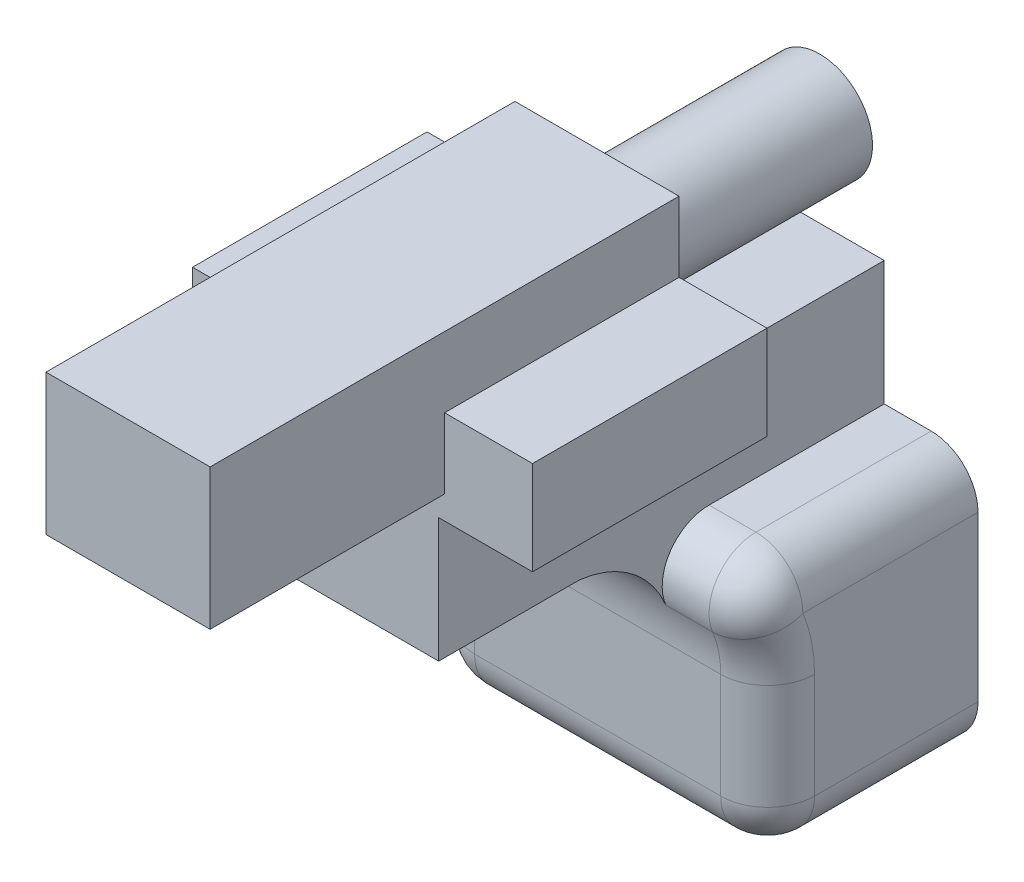
ISO-10303-21;
HEADER;
FILE_DESCRIPTION(('STEP AP214'),'2;1');
FILE_NAME('part.step','',(''),(''),'','','');
FILE_SCHEMA(('AUTOMOTIVE_DESIGN { 1 0 10303 214 1 1 1 1 }'));
ENDSEC;
DATA;
#1=APPLICATION_CONTEXT('core data for automotive mechanical design processes');
#2=APPLICATION_PROTOCOL_DEFINITION('international standard','automotive_design',2000,#1);
#3=PRODUCT_CONTEXT('',#1,'mechanical');
#4=PRODUCT('Part','Part','',(#3));
#5=PRODUCT_RELATED_PRODUCT_CATEGORY('part','',(#4));
#6=PRODUCT_DEFINITION_FORMATION('','',#4);
#7=PRODUCT_DEFINITION_CONTEXT('part definition',#1,'design');
#8=PRODUCT_DEFINITION('design','',#6,#7);
#9=PRODUCT_DEFINITION_SHAPE('','',#8);
#10=(LENGTH_UNIT() NAMED_UNIT(*) SI_UNIT(.MILLI.,.METRE.));
#11=(NAMED_UNIT(*) PLANE_ANGLE_UNIT() SI_UNIT($,.RADIAN.));
#12=(NAMED_UNIT(*) SI_UNIT($,.STERADIAN.) SOLID_ANGLE_UNIT());
#13=UNCERTAINTY_MEASURE_WITH_UNIT(LENGTH_MEASURE(1.E-05),#10,'distance_accuracy_value','');
#14=(GEOMETRIC_REPRESENTATION_CONTEXT(3) GLOBAL_UNCERTAINTY_ASSIGNED_CONTEXT((#13)) GLOBAL_UNIT_ASSIGNED_CONTEXT((#10,
#11,#12)) REPRESENTATION_CONTEXT('',''));
#15=CARTESIAN_POINT('',(0.,0.,0.));
#16=DIRECTION('',(0.,0.,1.));
#17=DIRECTION('',(1.,0.,0.));
#18=AXIS2_PLACEMENT_3D('',#15,#16,#17);
#19=CARTESIAN_POINT('',(-3.75,0.,10.));
#20=DIRECTION('',(0.,-1.,0.));
#21=DIRECTION('',(1.,0.,0.));
#22=AXIS2_PLACEMENT_3D('',#19,#20,#21);
#23=PLANE('',#22);
#24=DIRECTION('',(1.,0.,0.));
#25=VECTOR('',#24,1.);
#26=CARTESIAN_POINT('',(-3.75,0.,-9.));
#27=LINE('',#26,#25);
#28=CARTESIAN_POINT('',(-5.75,0.,-9.));
#29=VERTEX_POINT('',#28);
#30=CARTESIAN_POINT('',(-3.75,0.,-9.));
#31=VERTEX_POINT('',#30);
#32=EDGE_CURVE('E277',#29,#31,#27,.T.);
#33=ORIENTED_EDGE('',*,*,#32,.F.);
#34=DIRECTION('',(0.,0.,-1.));
#35=VECTOR('',#34,1.);
#36=CARTESIAN_POINT('',(-5.75,0.,10.));
#37=LINE('',#36,#35);
#38=CARTESIAN_POINT('',(-5.75,0.,-1.52998924346261));
#39=VERTEX_POINT('',#38);
#40=EDGE_CURVE('E59',#29,#39,#37,.F.);
#41=ORIENTED_EDGE('',*,*,#40,.T.);
#42=DIRECTION('',(-1.,0.,0.));
#43=VECTOR('',#42,1.);
#44=CARTESIAN_POINT('',(-3.75,0.,-1.52998924346261));
#45=LINE('',#44,#43);
#46=CARTESIAN_POINT('',(-3.75,0.,-1.52998924346261));
#47=VERTEX_POINT('',#46);
#48=EDGE_CURVE('E442',#39,#47,#45,.F.);
#49=ORIENTED_EDGE('',*,*,#48,.T.);
#50=DIRECTION('',(0.,0.,-1.));
#51=VECTOR('',#50,1.);
#52=CARTESIAN_POINT('',(-3.75,0.,10.));
#53=LINE('',#52,#51);
#54=EDGE_CURVE('E252',#47,#31,#53,.T.);
#55=ORIENTED_EDGE('',*,*,#54,.T.);
#56=EDGE_LOOP('',(#33,#41,#49,#55));
#57=FACE_BOUND('',#56,.T.);
#58=ADVANCED_FACE('F34',(#57),#23,.F.);
#59=CARTESIAN_POINT('',(-7.75,0.,10.));
#60=DIRECTION('',(1.,0.,0.));
#61=DIRECTION('',(0.,0.,-1.));
#62=AXIS2_PLACEMENT_3D('',#59,#60,#61);
#63=PLANE('',#62);
#64=CARTESIAN_POINT('',(-7.75,-4.5,4.5));
#65=DIRECTION('',(1.,0.,0.));
#66=DIRECTION('',(0.,0.,-1.));
#67=AXIS2_PLACEMENT_3D('',#64,#65,#66);
#68=CIRCLE('',#67,6.52769256906871);
#69=CARTESIAN_POINT('',(-7.75,-4.5,-2.02769256906871));
#70=VERTEX_POINT('',#69);
#71=CARTESIAN_POINT('',(-7.75,-2.,-1.52998924346261));
#72=VERTEX_POINT('',#71);
#73=EDGE_CURVE('E414',#70,#72,#68,.T.);
#74=ORIENTED_EDGE('',*,*,#73,.T.);
#75=DIRECTION('',(0.,0.,-1.));
#76=VECTOR('',#75,1.);
#77=CARTESIAN_POINT('',(-7.75,-2.,10.));
#78=LINE('',#77,#76);
#79=CARTESIAN_POINT('',(-7.75,-2.,-9.));
#80=VERTEX_POINT('',#79);
#81=EDGE_CURVE('E416',#72,#80,#78,.T.);
#82=ORIENTED_EDGE('',*,*,#81,.T.);
#83=DIRECTION('',(0.,1.,0.));
#84=VECTOR('',#83,1.);
#85=CARTESIAN_POINT('',(-7.75,0.,-9.));
#86=LINE('',#85,#84);
#87=CARTESIAN_POINT('',(-7.75,-9.,-9.));
#88=VERTEX_POINT('',#87);
#89=EDGE_CURVE('E274',#88,#80,#86,.T.);
#90=ORIENTED_EDGE('',*,*,#89,.F.);
#91=DIRECTION('',(0.,0.,-1.));
#92=VECTOR('',#91,1.);
#93=CARTESIAN_POINT('',(-7.75,-9.,10.));
#94=LINE('',#93,#92);
#95=CARTESIAN_POINT('',(-7.75,-9.,-2.02769256906871));
#96=VERTEX_POINT('',#95);
#97=EDGE_CURVE('E410',#88,#96,#94,.F.);
#98=ORIENTED_EDGE('',*,*,#97,.T.);
#99=DIRECTION('',(0.,-1.,0.));
#100=VECTOR('',#99,1.);
#101=CARTESIAN_POINT('',(-7.75,-4.5,-2.02769256906871));
#102=LINE('',#101,#100);
#103=EDGE_CURVE('E412',#96,#70,#102,.F.);
#104=ORIENTED_EDGE('',*,*,#103,.T.);
#105=EDGE_LOOP('',(#74,#82,#90,#98,#104));
#106=FACE_BOUND('',#105,.T.);
#107=ADVANCED_FACE('F497',(#106),#63,.F.);
#108=CARTESIAN_POINT('',(-7.75,-11.,10.));
#109=DIRECTION('',(0.,1.,0.));
#110=DIRECTION('',(0.,0.,1.));
#111=AXIS2_PLACEMENT_3D('',#108,#109,#110);
#112=PLANE('',#111);
#113=DIRECTION('',(1.,0.,0.));
#114=VECTOR('',#113,1.);
#115=CARTESIAN_POINT('',(-7.75,-11.,-2.02769256906871));
#116=LINE('',#115,#114);
#117=CARTESIAN_POINT('',(4.75,-11.,-2.02769256906871));
#118=VERTEX_POINT('',#117);
#119=CARTESIAN_POINT('',(-5.75,-11.,-2.02769256906871));
#120=VERTEX_POINT('',#119);
#121=EDGE_CURVE('E426',#118,#120,#116,.F.);
#122=ORIENTED_EDGE('',*,*,#121,.T.);
#123=DIRECTION('',(0.,0.,-1.));
#124=VECTOR('',#123,1.);
#125=CARTESIAN_POINT('',(-5.75,-11.,10.));
#126=LINE('',#125,#124);
#127=CARTESIAN_POINT('',(-5.75,-11.,-9.));
#128=VERTEX_POINT('',#127);
#129=EDGE_CURVE('E428',#120,#128,#126,.T.);
#130=ORIENTED_EDGE('',*,*,#129,.T.);
#131=DIRECTION('',(-1.,0.,0.));
#132=VECTOR('',#131,1.);
#133=CARTESIAN_POINT('',(-7.75,-11.,-9.));
#134=LINE('',#133,#132);
#135=CARTESIAN_POINT('',(4.75,-11.,-9.));
#136=VERTEX_POINT('',#135);
#137=EDGE_CURVE('E271',#136,#128,#134,.T.);
#138=ORIENTED_EDGE('',*,*,#137,.F.);
#139=DIRECTION('',(0.,0.,-1.));
#140=VECTOR('',#139,1.);
#141=CARTESIAN_POINT('',(4.75,-11.,10.));
#142=LINE('',#141,#140);
#143=EDGE_CURVE('E424',#136,#118,#142,.F.);
#144=ORIENTED_EDGE('',*,*,#143,.T.);
#145=EDGE_LOOP('',(#122,#130,#138,#144));
#146=FACE_BOUND('',#145,.T.);
#147=ADVANCED_FACE('F594',(#146),#112,.F.);
#148=CARTESIAN_POINT('',(6.75,-11.,10.));
#149=DIRECTION('',(-1.,0.,0.));
#150=DIRECTION('',(0.,-1.,0.));
#151=AXIS2_PLACEMENT_3D('',#148,#149,#150);
#152=PLANE('',#151);
#153=DIRECTION('',(0.,-1.,0.));
#154=VECTOR('',#153,1.);
#155=CARTESIAN_POINT('',(6.75,-11.,-9.));
#156=LINE('',#155,#154);
#157=CARTESIAN_POINT('',(6.75,-2.,-9.));
#158=VERTEX_POINT('',#157);
#159=CARTESIAN_POINT('',(6.75,-9.,-9.));
#160=VERTEX_POINT('',#159);
#161=EDGE_CURVE('E268',#158,#160,#156,.T.);
#162=ORIENTED_EDGE('',*,*,#161,.F.);
#163=DIRECTION('',(0.,0.,-1.));
#164=VECTOR('',#163,1.);
#165=CARTESIAN_POINT('',(6.75,-2.,10.));
#166=LINE('',#165,#164);
#167=CARTESIAN_POINT('',(6.75,-2.,-1.52998924346261));
#168=VERTEX_POINT('',#167);
#169=EDGE_CURVE('E243',#158,#168,#166,.F.);
#170=ORIENTED_EDGE('',*,*,#169,.T.);
#171=CARTESIAN_POINT('',(6.75,-4.5,4.5));
#172=DIRECTION('',(-1.,0.,0.));
#173=DIRECTION('',(0.,-1.,0.));
#174=AXIS2_PLACEMENT_3D('',#171,#172,#173);
#175=CIRCLE('',#174,6.52769256906871);
#176=CARTESIAN_POINT('',(6.75,-4.5,-2.02769256906871));
#177=VERTEX_POINT('',#176);
#178=EDGE_CURVE('E398',#168,#177,#175,.T.);
#179=ORIENTED_EDGE('',*,*,#178,.T.);
#180=DIRECTION('',(0.,-1.,0.));
#181=VECTOR('',#180,1.);
#182=CARTESIAN_POINT('',(6.75,-11.,-2.02769256906871));
#183=LINE('',#182,#181);
#184=CARTESIAN_POINT('',(6.75,-9.,-2.02769256906871));
#185=VERTEX_POINT('',#184);
#186=EDGE_CURVE('E396',#177,#185,#183,.T.);
#187=ORIENTED_EDGE('',*,*,#186,.T.);
#188=DIRECTION('',(0.,0.,-1.));
#189=VECTOR('',#188,1.);
#190=CARTESIAN_POINT('',(6.75,-9.,10.));
#191=LINE('',#190,#189);
#192=EDGE_CURVE('E300',#185,#160,#191,.T.);
#193=ORIENTED_EDGE('',*,*,#192,.T.);
#194=EDGE_LOOP('',(#162,#170,#179,#187,#193));
#195=FACE_BOUND('',#194,.T.);
#196=ADVANCED_FACE('F599',(#195),#152,.F.);
#197=CARTESIAN_POINT('',(2.75,0.,10.));
#198=DIRECTION('',(0.,-1.,0.));
#199=DIRECTION('',(1.,0.,0.));
#200=AXIS2_PLACEMENT_3D('',#197,#198,#199);
#201=PLANE('',#200);
#202=DIRECTION('',(-1.,0.,0.));
#203=VECTOR('',#202,1.);
#204=CARTESIAN_POINT('',(6.75,0.,-1.52998924346261));
#205=LINE('',#204,#203);
#206=CARTESIAN_POINT('',(2.75,0.,-1.52998924346261));
#207=VERTEX_POINT('',#206);
#208=CARTESIAN_POINT('',(4.75,0.,-1.52998924346261));
#209=VERTEX_POINT('',#208);
#210=EDGE_CURVE('E430',#207,#209,#205,.F.);
#211=ORIENTED_EDGE('',*,*,#210,.T.);
#212=DIRECTION('',(0.,0.,-1.));
#213=VECTOR('',#212,1.);
#214=CARTESIAN_POINT('',(4.75,0.,10.));
#215=LINE('',#214,#213);
#216=CARTESIAN_POINT('',(4.75,0.,-9.));
#217=VERTEX_POINT('',#216);
#218=EDGE_CURVE('E432',#209,#217,#215,.T.);
#219=ORIENTED_EDGE('',*,*,#218,.T.);
#220=DIRECTION('',(1.,0.,0.));
#221=VECTOR('',#220,1.);
#222=CARTESIAN_POINT('',(6.75,0.,-9.));
#223=LINE('',#222,#221);
#224=CARTESIAN_POINT('',(2.75,0.,-9.));
#225=VERTEX_POINT('',#224);
#226=EDGE_CURVE('E265',#225,#217,#223,.T.);
#227=ORIENTED_EDGE('',*,*,#226,.F.);
#228=DIRECTION('',(0.,0.,-1.));
#229=VECTOR('',#228,1.);
#230=CARTESIAN_POINT('',(2.75,0.,10.));
#231=LINE('',#230,#229);
#232=EDGE_CURVE('E253',#207,#225,#231,.T.);
#233=ORIENTED_EDGE('',*,*,#232,.F.);
#234=EDGE_LOOP('',(#211,#219,#227,#233));
#235=FACE_BOUND('',#234,.T.);
#236=ADVANCED_FACE('F547',(#235),#201,.F.);
#237=CARTESIAN_POINT('',(0.,0.,0.));
#238=DIRECTION('',(0.,0.,1.));
#239=DIRECTION('',(1.,0.,0.));
#240=AXIS2_PLACEMENT_3D('',#237,#238,#239);
#241=PLANE('',#240);
#242=CARTESIAN_POINT('',(0.,9.3,0.));
#243=DIRECTION('',(0.,0.,-1.));
#244=DIRECTION('',(-1.,0.,0.));
#245=AXIS2_PLACEMENT_3D('',#242,#243,#244);
#246=CIRCLE('',#245,2.25);
#247=CARTESIAN_POINT('',(-2.25,9.3,0.));
#248=VERTEX_POINT('',#247);
#249=EDGE_CURVE('E297',#248,#248,#246,.T.);
#250=ORIENTED_EDGE('',*,*,#249,.F.);
#251=EDGE_LOOP('',(#250));
#252=FACE_BOUND('',#251,.T.);
#253=DIRECTION('',(1.,0.,0.));
#254=VECTOR('',#253,1.);
#255=CARTESIAN_POINT('',(2.75,5.3,0.));
#256=LINE('',#255,#254);
#257=CARTESIAN_POINT('',(-3.75,5.3,0.));
#258=VERTEX_POINT('',#257);
#259=CARTESIAN_POINT('',(2.75,5.3,0.));
#260=VERTEX_POINT('',#259);
#261=EDGE_CURVE('E260',#258,#260,#256,.T.);
#262=ORIENTED_EDGE('',*,*,#261,.F.);
#263=DIRECTION('',(1.,0.,0.));
#264=VECTOR('',#263,1.);
#265=CARTESIAN_POINT('',(-7.75,5.3,0.));
#266=LINE('',#265,#264);
#267=CARTESIAN_POINT('',(-7.75,5.3,0.));
#268=VERTEX_POINT('',#267);
#269=EDGE_CURVE('E360',#268,#258,#266,.T.);
#270=ORIENTED_EDGE('',*,*,#269,.F.);
#271=DIRECTION('',(0.,-1.,0.));
#272=VECTOR('',#271,1.);
#273=CARTESIAN_POINT('',(-7.75,9.3,0.));
#274=LINE('',#273,#272);
#275=CARTESIAN_POINT('',(-7.75,9.3,0.));
#276=VERTEX_POINT('',#275);
#277=EDGE_CURVE('E358',#276,#268,#274,.T.);
#278=ORIENTED_EDGE('',*,*,#277,.F.);
#279=DIRECTION('',(-1.,0.,0.));
#280=VECTOR('',#279,1.);
#281=CARTESIAN_POINT('',(-4.,9.3,0.));
#282=LINE('',#281,#280);
#283=CARTESIAN_POINT('',(-4.,9.3,0.));
#284=VERTEX_POINT('',#283);
#285=EDGE_CURVE('E356',#284,#276,#282,.T.);
#286=ORIENTED_EDGE('',*,*,#285,.F.);
#287=DIRECTION('',(0.,-1.,0.));
#288=VECTOR('',#287,1.);
#289=CARTESIAN_POINT('',(-4.,9.3,0.));
#290=LINE('',#289,#288);
#291=CARTESIAN_POINT('',(-4.,12.3,0.));
#292=VERTEX_POINT('',#291);
#293=EDGE_CURVE('E354',#292,#284,#290,.T.);
#294=ORIENTED_EDGE('',*,*,#293,.F.);
#295=DIRECTION('',(-1.,0.,0.));
#296=VECTOR('',#295,1.);
#297=CARTESIAN_POINT('',(-4.,12.3,0.));
#298=LINE('',#297,#296);
#299=CARTESIAN_POINT('',(3.,12.3,0.));
#300=VERTEX_POINT('',#299);
#301=EDGE_CURVE('E352',#300,#292,#298,.T.);
#302=ORIENTED_EDGE('',*,*,#301,.F.);
#303=DIRECTION('',(0.,1.,0.));
#304=VECTOR('',#303,1.);
#305=CARTESIAN_POINT('',(3.,12.3,0.));
#306=LINE('',#305,#304);
#307=CARTESIAN_POINT('',(3.,9.3,0.));
#308=VERTEX_POINT('',#307);
#309=EDGE_CURVE('E350',#308,#300,#306,.T.);
#310=ORIENTED_EDGE('',*,*,#309,.F.);
#311=DIRECTION('',(-1.,0.,0.));
#312=VECTOR('',#311,1.);
#313=CARTESIAN_POINT('',(6.75,9.3,0.));
#314=LINE('',#313,#312);
#315=CARTESIAN_POINT('',(6.75,9.3,0.));
#316=VERTEX_POINT('',#315);
#317=EDGE_CURVE('E348',#316,#308,#314,.T.);
#318=ORIENTED_EDGE('',*,*,#317,.F.);
#319=DIRECTION('',(0.,1.,0.));
#320=VECTOR('',#319,1.);
#321=CARTESIAN_POINT('',(6.75,5.3,0.));
#322=LINE('',#321,#320);
#323=CARTESIAN_POINT('',(6.75,5.3,0.));
#324=VERTEX_POINT('',#323);
#325=EDGE_CURVE('E326',#324,#316,#322,.T.);
#326=ORIENTED_EDGE('',*,*,#325,.F.);
#327=DIRECTION('',(1.,0.,0.));
#328=VECTOR('',#327,1.);
#329=CARTESIAN_POINT('',(2.75,5.3,0.));
#330=LINE('',#329,#328);
#331=EDGE_CURVE('E331',#260,#324,#330,.T.);
#332=ORIENTED_EDGE('',*,*,#331,.F.);
#333=EDGE_LOOP('',(#262,#270,#278,#286,#294,#302,#310,#318,#326,#332));
#334=FACE_BOUND('',#333,.T.);
#335=ADVANCED_FACE('F565',(#252,#334),#241,.F.);
#336=CARTESIAN_POINT('',(6.75,5.3,10.));
#337=DIRECTION('',(-1.,0.,0.));
#338=DIRECTION('',(0.,0.,1.));
#339=AXIS2_PLACEMENT_3D('',#336,#337,#338);
#340=PLANE('',#339);
#341=ORIENTED_EDGE('',*,*,#325,.T.);
#342=DIRECTION('',(0.,0.,-1.));
#343=VECTOR('',#342,1.);
#344=CARTESIAN_POINT('',(6.75,9.3,10.));
#345=LINE('',#344,#343);
#346=CARTESIAN_POINT('',(6.75,9.3,10.));
#347=VERTEX_POINT('',#346);
#348=EDGE_CURVE('E391',#347,#316,#345,.T.);
#349=ORIENTED_EDGE('',*,*,#348,.F.);
#350=DIRECTION('',(0.,1.,0.));
#351=VECTOR('',#350,1.);
#352=CARTESIAN_POINT('',(6.75,5.3,10.));
#353=LINE('',#352,#351);
#354=CARTESIAN_POINT('',(6.75,5.3,10.));
#355=VERTEX_POINT('',#354);
#356=EDGE_CURVE('E327',#355,#347,#353,.T.);
#357=ORIENTED_EDGE('',*,*,#356,.F.);
#358=DIRECTION('',(0.,0.,-1.));
#359=VECTOR('',#358,1.);
#360=CARTESIAN_POINT('',(6.75,5.3,10.));
#361=LINE('',#360,#359);
#362=EDGE_CURVE('E345',#355,#324,#361,.T.);
#363=ORIENTED_EDGE('',*,*,#362,.T.);
#364=EDGE_LOOP('',(#341,#349,#357,#363));
#365=FACE_BOUND('',#364,.T.);
#366=ADVANCED_FACE('F569',(#365),#340,.F.);
#367=CARTESIAN_POINT('',(6.75,9.3,10.));
#368=DIRECTION('',(0.,-1.,0.));
#369=DIRECTION('',(0.,0.,-1.));
#370=AXIS2_PLACEMENT_3D('',#367,#368,#369);
#371=PLANE('',#370);
#372=ORIENTED_EDGE('',*,*,#317,.T.);
#373=DIRECTION('',(0.,0.,-1.));
#374=VECTOR('',#373,1.);
#375=CARTESIAN_POINT('',(3.,9.3,10.));
#376=LINE('',#375,#374);
#377=CARTESIAN_POINT('',(3.,9.3,10.));
#378=VERTEX_POINT('',#377);
#379=EDGE_CURVE('E388',#378,#308,#376,.T.);
#380=ORIENTED_EDGE('',*,*,#379,.F.);
#381=DIRECTION('',(-1.,0.,0.));
#382=VECTOR('',#381,1.);
#383=CARTESIAN_POINT('',(6.75,9.3,10.));
#384=LINE('',#383,#382);
#385=EDGE_CURVE('E330',#347,#378,#384,.T.);
#386=ORIENTED_EDGE('',*,*,#385,.F.);
#387=ORIENTED_EDGE('',*,*,#348,.T.);
#388=EDGE_LOOP('',(#372,#380,#386,#387));
#389=FACE_BOUND('',#388,.T.);
#390=ADVANCED_FACE('F683',(#389),#371,.F.);
#391=CARTESIAN_POINT('',(3.,12.3,10.));
#392=DIRECTION('',(-1.,0.,0.));
#393=DIRECTION('',(0.,0.,1.));
#394=AXIS2_PLACEMENT_3D('',#391,#392,#393);
#395=PLANE('',#394);
#396=ORIENTED_EDGE('',*,*,#309,.T.);
#397=DIRECTION('',(0.,0.,-1.));
#398=VECTOR('',#397,1.);
#399=CARTESIAN_POINT('',(3.,12.3,10.));
#400=LINE('',#399,#398);
#401=CARTESIAN_POINT('',(3.,12.3,20.));
#402=VERTEX_POINT('',#401);
#403=EDGE_CURVE('E385',#402,#300,#400,.T.);
#404=ORIENTED_EDGE('',*,*,#403,.F.);
#405=DIRECTION('',(0.,1.,0.));
#406=VECTOR('',#405,1.);
#407=CARTESIAN_POINT('',(3.,6.3,20.));
#408=LINE('',#407,#406);
#409=CARTESIAN_POINT('',(3.,6.3,20.));
#410=VERTEX_POINT('',#409);
#411=EDGE_CURVE('E302',#410,#402,#408,.T.);
#412=ORIENTED_EDGE('',*,*,#411,.F.);
#413=DIRECTION('',(0.,0.,-1.));
#414=VECTOR('',#413,1.);
#415=CARTESIAN_POINT('',(3.,6.3,20.));
#416=LINE('',#415,#414);
#417=CARTESIAN_POINT('',(3.,6.3,10.));
#418=VERTEX_POINT('',#417);
#419=EDGE_CURVE('E313',#410,#418,#416,.T.);
#420=ORIENTED_EDGE('',*,*,#419,.T.);
#421=DIRECTION('',(0.,1.,0.));
#422=VECTOR('',#421,1.);
#423=CARTESIAN_POINT('',(3.,9.3,10.));
#424=LINE('',#423,#422);
#425=EDGE_CURVE('E296',#418,#378,#424,.T.);
#426=ORIENTED_EDGE('',*,*,#425,.T.);
#427=ORIENTED_EDGE('',*,*,#379,.T.);
#428=EDGE_LOOP('',(#396,#404,#412,#420,#426,#427));
#429=FACE_BOUND('',#428,.T.);
#430=ADVANCED_FACE('F686',(#429),#395,.F.);
#431=CARTESIAN_POINT('',(-4.,12.3,10.));
#432=DIRECTION('',(0.,-1.,0.));
#433=DIRECTION('',(0.,0.,-1.));
#434=AXIS2_PLACEMENT_3D('',#431,#432,#433);
#435=PLANE('',#434);
#436=ORIENTED_EDGE('',*,*,#301,.T.);
#437=DIRECTION('',(0.,0.,-1.));
#438=VECTOR('',#437,1.);
#439=CARTESIAN_POINT('',(-4.,12.3,10.));
#440=LINE('',#439,#438);
#441=CARTESIAN_POINT('',(-4.,12.3,20.));
#442=VERTEX_POINT('',#441);
#443=EDGE_CURVE('E382',#442,#292,#440,.T.);
#444=ORIENTED_EDGE('',*,*,#443,.F.);
#445=DIRECTION('',(-1.,0.,0.));
#446=VECTOR('',#445,1.);
#447=CARTESIAN_POINT('',(3.,12.3,20.));
#448=LINE('',#447,#446);
#449=EDGE_CURVE('E305',#402,#442,#448,.T.);
#450=ORIENTED_EDGE('',*,*,#449,.F.);
#451=ORIENTED_EDGE('',*,*,#403,.T.);
#452=EDGE_LOOP('',(#436,#444,#450,#451));
#453=FACE_BOUND('',#452,.T.);
#454=ADVANCED_FACE('F690',(#453),#435,.F.);
#455=CARTESIAN_POINT('',(-4.,9.3,10.));
#456=DIRECTION('',(1.,0.,0.));
#457=DIRECTION('',(0.,0.,-1.));
#458=AXIS2_PLACEMENT_3D('',#455,#456,#457);
#459=PLANE('',#458);
#460=ORIENTED_EDGE('',*,*,#293,.T.);
#461=DIRECTION('',(0.,0.,-1.));
#462=VECTOR('',#461,1.);
#463=CARTESIAN_POINT('',(-4.,9.3,10.));
#464=LINE('',#463,#462);
#465=CARTESIAN_POINT('',(-4.,9.3,10.));
#466=VERTEX_POINT('',#465);
#467=EDGE_CURVE('E379',#466,#284,#464,.T.);
#468=ORIENTED_EDGE('',*,*,#467,.F.);
#469=DIRECTION('',(0.,-1.,0.));
#470=VECTOR('',#469,1.);
#471=CARTESIAN_POINT('',(-4.,9.3,10.));
#472=LINE('',#471,#470);
#473=CARTESIAN_POINT('',(-4.,6.3,10.));
#474=VERTEX_POINT('',#473);
#475=EDGE_CURVE('E301',#466,#474,#472,.T.);
#476=ORIENTED_EDGE('',*,*,#475,.T.);
#477=DIRECTION('',(0.,0.,-1.));
#478=VECTOR('',#477,1.);
#479=CARTESIAN_POINT('',(-4.,6.3,20.));
#480=LINE('',#479,#478);
#481=CARTESIAN_POINT('',(-4.,6.3,20.));
#482=VERTEX_POINT('',#481);
#483=EDGE_CURVE('E323',#482,#474,#480,.T.);
#484=ORIENTED_EDGE('',*,*,#483,.F.);
#485=DIRECTION('',(0.,-1.,0.));
#486=VECTOR('',#485,1.);
#487=CARTESIAN_POINT('',(-4.,12.3,20.));
#488=LINE('',#487,#486);
#489=EDGE_CURVE('E309',#442,#482,#488,.T.);
#490=ORIENTED_EDGE('',*,*,#489,.F.);
#491=ORIENTED_EDGE('',*,*,#443,.T.);
#492=EDGE_LOOP('',(#460,#468,#476,#484,#490,#491));
#493=FACE_BOUND('',#492,.T.);
#494=ADVANCED_FACE('F694',(#493),#459,.F.);
#495=CARTESIAN_POINT('',(-4.,9.3,10.));
#496=DIRECTION('',(0.,-1.,0.));
#497=DIRECTION('',(0.,0.,-1.));
#498=AXIS2_PLACEMENT_3D('',#495,#496,#497);
#499=PLANE('',#498);
#500=ORIENTED_EDGE('',*,*,#285,.T.);
#501=DIRECTION('',(0.,0.,-1.));
#502=VECTOR('',#501,1.);
#503=CARTESIAN_POINT('',(-7.75,9.3,10.));
#504=LINE('',#503,#502);
#505=CARTESIAN_POINT('',(-7.75,9.3,10.));
#506=VERTEX_POINT('',#505);
#507=EDGE_CURVE('E376',#506,#276,#504,.T.);
#508=ORIENTED_EDGE('',*,*,#507,.F.);
#509=DIRECTION('',(-1.,0.,0.));
#510=VECTOR('',#509,1.);
#511=CARTESIAN_POINT('',(-4.,9.3,10.));
#512=LINE('',#511,#510);
#513=EDGE_CURVE('E333',#466,#506,#512,.T.);
#514=ORIENTED_EDGE('',*,*,#513,.F.);
#515=ORIENTED_EDGE('',*,*,#467,.T.);
#516=EDGE_LOOP('',(#500,#508,#514,#515));
#517=FACE_BOUND('',#516,.T.);
#518=ADVANCED_FACE('F698',(#517),#499,.F.);
#519=CARTESIAN_POINT('',(-7.75,9.3,10.));
#520=DIRECTION('',(1.,0.,0.));
#521=DIRECTION('',(0.,0.,-1.));
#522=AXIS2_PLACEMENT_3D('',#519,#520,#521);
#523=PLANE('',#522);
#524=ORIENTED_EDGE('',*,*,#277,.T.);
#525=DIRECTION('',(0.,0.,-1.));
#526=VECTOR('',#525,1.);
#527=CARTESIAN_POINT('',(-7.75,5.3,10.));
#528=LINE('',#527,#526);
#529=CARTESIAN_POINT('',(-7.75,5.3,10.));
#530=VERTEX_POINT('',#529);
#531=EDGE_CURVE('E373',#530,#268,#528,.T.);
#532=ORIENTED_EDGE('',*,*,#531,.F.);
#533=DIRECTION('',(0.,-1.,0.));
#534=VECTOR('',#533,1.);
#535=CARTESIAN_POINT('',(-7.75,9.3,10.));
#536=LINE('',#535,#534);
#537=EDGE_CURVE('E335',#506,#530,#536,.T.);
#538=ORIENTED_EDGE('',*,*,#537,.F.);
#539=ORIENTED_EDGE('',*,*,#507,.T.);
#540=EDGE_LOOP('',(#524,#532,#538,#539));
#541=FACE_BOUND('',#540,.T.);
#542=ADVANCED_FACE('F586',(#541),#523,.F.);
#543=CARTESIAN_POINT('',(-7.75,5.3,10.));
#544=DIRECTION('',(0.,1.,0.));
#545=DIRECTION('',(0.,0.,1.));
#546=AXIS2_PLACEMENT_3D('',#543,#544,#545);
#547=PLANE('',#546);
#548=ORIENTED_EDGE('',*,*,#269,.T.);
#549=DIRECTION('',(0.,0.,-1.));
#550=VECTOR('',#549,1.);
#551=CARTESIAN_POINT('',(-3.75,5.3,10.));
#552=LINE('',#551,#550);
#553=CARTESIAN_POINT('',(-3.75,5.3,10.));
#554=VERTEX_POINT('',#553);
#555=EDGE_CURVE('E370',#554,#258,#552,.T.);
#556=ORIENTED_EDGE('',*,*,#555,.F.);
#557=DIRECTION('',(1.,0.,0.));
#558=VECTOR('',#557,1.);
#559=CARTESIAN_POINT('',(-7.75,5.3,10.));
#560=LINE('',#559,#558);
#561=EDGE_CURVE('E337',#530,#554,#560,.T.);
#562=ORIENTED_EDGE('',*,*,#561,.F.);
#563=ORIENTED_EDGE('',*,*,#531,.T.);
#564=EDGE_LOOP('',(#548,#556,#562,#563));
#565=FACE_BOUND('',#564,.T.);
#566=ADVANCED_FACE('F579',(#565),#547,.F.);
#567=CARTESIAN_POINT('',(-3.75,5.3,10.));
#568=DIRECTION('',(1.,0.,0.));
#569=DIRECTION('',(0.,1.,0.));
#570=AXIS2_PLACEMENT_3D('',#567,#568,#569);
#571=PLANE('',#570);
#572=ORIENTED_EDGE('',*,*,#555,.T.);
#573=DIRECTION('',(0.,0.,1.));
#574=VECTOR('',#573,1.);
#575=CARTESIAN_POINT('',(-3.75,5.3,-9.));
#576=LINE('',#575,#574);
#577=CARTESIAN_POINT('',(-3.75,5.3,-9.));
#578=VERTEX_POINT('',#577);
#579=EDGE_CURVE('E291',#578,#258,#576,.T.);
#580=ORIENTED_EDGE('',*,*,#579,.F.);
#581=DIRECTION('',(0.,1.,0.));
#582=VECTOR('',#581,1.);
#583=CARTESIAN_POINT('',(-3.75,5.3,-9.));
#584=LINE('',#583,#582);
#585=EDGE_CURVE('E280',#31,#578,#584,.T.);
#586=ORIENTED_EDGE('',*,*,#585,.F.);
#587=ORIENTED_EDGE('',*,*,#54,.F.);
#588=CARTESIAN_POINT('',(-3.75,-2.,-1.52998924346261));
#589=DIRECTION('',(1.,0.,0.));
#590=DIRECTION('',(0.,1.,0.));
#591=AXIS2_PLACEMENT_3D('',#588,#589,#590);
#592=CIRCLE('',#591,2.);
#593=CARTESIAN_POINT('',(-3.75,-2.76596744517234,0.317520938630076));
#594=VERTEX_POINT('',#593);
#595=EDGE_CURVE('E43',#47,#594,#592,.T.);
#596=ORIENTED_EDGE('',*,*,#595,.T.);
#597=CARTESIAN_POINT('',(-3.75,-4.5,4.5));
#598=DIRECTION('',(1.,0.,0.));
#599=DIRECTION('',(0.,1.,0.));
#600=AXIS2_PLACEMENT_3D('',#597,#598,#599);
#601=CIRCLE('',#600,4.52769256906871);
#602=CARTESIAN_POINT('',(-3.75,0.,4.));
#603=VERTEX_POINT('',#602);
#604=EDGE_CURVE('E51',#603,#594,#601,.F.);
#605=ORIENTED_EDGE('',*,*,#604,.F.);
#606=CARTESIAN_POINT('',(-3.75,0.,10.));
#607=VERTEX_POINT('',#606);
#608=EDGE_CURVE('E256',#607,#603,#53,.T.);
#609=ORIENTED_EDGE('',*,*,#608,.F.);
#610=DIRECTION('',(0.,-1.,0.));
#611=VECTOR('',#610,1.);
#612=CARTESIAN_POINT('',(-3.75,5.3,10.));
#613=LINE('',#612,#611);
#614=EDGE_CURVE('E339',#554,#607,#613,.T.);
#615=ORIENTED_EDGE('',*,*,#614,.F.);
#616=EDGE_LOOP('',(#572,#580,#586,#587,#596,#605,#609,#615));
#617=FACE_BOUND('',#616,.T.);
#618=ADVANCED_FACE('F577',(#617),#571,.F.);
#619=CARTESIAN_POINT('',(2.75,0.,10.));
#620=DIRECTION('',(-1.,0.,0.));
#621=DIRECTION('',(0.,-1.,0.));
#622=AXIS2_PLACEMENT_3D('',#619,#620,#621);
#623=PLANE('',#622);
#624=CARTESIAN_POINT('',(2.75,0.,10.));
#625=VERTEX_POINT('',#624);
#626=CARTESIAN_POINT('',(2.75,0.,4.));
#627=VERTEX_POINT('',#626);
#628=EDGE_CURVE('E246',#625,#627,#231,.T.);
#629=ORIENTED_EDGE('',*,*,#628,.T.);
#630=CARTESIAN_POINT('',(2.75,-4.5,4.5));
#631=DIRECTION('',(-1.,0.,0.));
#632=DIRECTION('',(0.,-1.,0.));
#633=AXIS2_PLACEMENT_3D('',#630,#631,#632);
#634=CIRCLE('',#633,4.52769256906871);
#635=CARTESIAN_POINT('',(2.75,-2.76596744517234,0.317520938630077));
#636=VERTEX_POINT('',#635);
#637=EDGE_CURVE('E233',#636,#627,#634,.F.);
#638=ORIENTED_EDGE('',*,*,#637,.F.);
#639=CARTESIAN_POINT('',(2.75,-2.,-1.52998924346261));
#640=DIRECTION('',(-1.,0.,0.));
#641=DIRECTION('',(0.,-1.,0.));
#642=AXIS2_PLACEMENT_3D('',#639,#640,#641);
#643=CIRCLE('',#642,2.);
#644=EDGE_CURVE('E12',#636,#207,#643,.T.);
#645=ORIENTED_EDGE('',*,*,#644,.T.);
#646=ORIENTED_EDGE('',*,*,#232,.T.);
#647=DIRECTION('',(0.,-1.,0.));
#648=VECTOR('',#647,1.);
#649=CARTESIAN_POINT('',(2.75,0.,-9.));
#650=LINE('',#649,#648);
#651=CARTESIAN_POINT('',(2.75,5.3,-9.));
#652=VERTEX_POINT('',#651);
#653=EDGE_CURVE('E284',#652,#225,#650,.T.);
#654=ORIENTED_EDGE('',*,*,#653,.F.);
#655=DIRECTION('',(0.,0.,1.));
#656=VECTOR('',#655,1.);
#657=CARTESIAN_POINT('',(2.75,5.3,-9.));
#658=LINE('',#657,#656);
#659=EDGE_CURVE('E287',#652,#260,#658,.T.);
#660=ORIENTED_EDGE('',*,*,#659,.T.);
#661=DIRECTION('',(0.,0.,-1.));
#662=VECTOR('',#661,1.);
#663=CARTESIAN_POINT('',(2.75,5.3,10.));
#664=LINE('',#663,#662);
#665=CARTESIAN_POINT('',(2.75,5.3,10.));
#666=VERTEX_POINT('',#665);
#667=EDGE_CURVE('E366',#666,#260,#664,.T.);
#668=ORIENTED_EDGE('',*,*,#667,.F.);
#669=DIRECTION('',(0.,1.,0.));
#670=VECTOR('',#669,1.);
#671=CARTESIAN_POINT('',(2.75,0.,10.));
#672=LINE('',#671,#670);
#673=EDGE_CURVE('E249',#625,#666,#672,.T.);
#674=ORIENTED_EDGE('',*,*,#673,.F.);
#675=EDGE_LOOP('',(#629,#638,#645,#646,#654,#660,#668,#674));
#676=FACE_BOUND('',#675,.T.);
#677=ADVANCED_FACE('F247',(#676),#623,.F.);
#678=CARTESIAN_POINT('',(2.75,5.3,10.));
#679=DIRECTION('',(0.,1.,0.));
#680=DIRECTION('',(0.,0.,1.));
#681=AXIS2_PLACEMENT_3D('',#678,#679,#680);
#682=PLANE('',#681);
#683=ORIENTED_EDGE('',*,*,#331,.T.);
#684=ORIENTED_EDGE('',*,*,#362,.F.);
#685=DIRECTION('',(1.,0.,0.));
#686=VECTOR('',#685,1.);
#687=CARTESIAN_POINT('',(2.75,5.3,10.));
#688=LINE('',#687,#686);
#689=EDGE_CURVE('E343',#666,#355,#688,.T.);
#690=ORIENTED_EDGE('',*,*,#689,.F.);
#691=ORIENTED_EDGE('',*,*,#667,.T.);
#692=EDGE_LOOP('',(#683,#684,#690,#691));
#693=FACE_BOUND('',#692,.T.);
#694=ADVANCED_FACE('F562',(#693),#682,.F.);
#695=CARTESIAN_POINT('',(0.,0.,10.));
#696=DIRECTION('',(0.,0.,1.));
#697=DIRECTION('',(1.,0.,0.));
#698=AXIS2_PLACEMENT_3D('',#695,#696,#697);
#699=PLANE('',#698);
#700=ORIENTED_EDGE('',*,*,#425,.F.);
#701=DIRECTION('',(1.,0.,0.));
#702=VECTOR('',#701,1.);
#703=CARTESIAN_POINT('',(-4.,6.3,10.));
#704=LINE('',#703,#702);
#705=EDGE_CURVE('E306',#474,#418,#704,.T.);
#706=ORIENTED_EDGE('',*,*,#705,.F.);
#707=ORIENTED_EDGE('',*,*,#475,.F.);
#708=ORIENTED_EDGE('',*,*,#513,.T.);
#709=ORIENTED_EDGE('',*,*,#537,.T.);
#710=ORIENTED_EDGE('',*,*,#561,.T.);
#711=ORIENTED_EDGE('',*,*,#614,.T.);
#712=DIRECTION('',(-1.,0.,0.));
#713=VECTOR('',#712,1.);
#714=CARTESIAN_POINT('',(0.,0.,10.));
#715=LINE('',#714,#713);
#716=EDGE_CURVE('E318',#625,#607,#715,.T.);
#717=ORIENTED_EDGE('',*,*,#716,.F.);
#718=ORIENTED_EDGE('',*,*,#673,.T.);
#719=ORIENTED_EDGE('',*,*,#689,.T.);
#720=ORIENTED_EDGE('',*,*,#356,.T.);
#721=ORIENTED_EDGE('',*,*,#385,.T.);
#722=EDGE_LOOP('',(#700,#706,#707,#708,#709,#710,#711,#717,#718,#719,#720,#721));
#723=FACE_BOUND('',#722,.T.);
#724=ADVANCED_FACE('F572',(#723),#699,.T.);
#725=CARTESIAN_POINT('',(-7.75,0.,8.));
#726=DIRECTION('',(0.,1.,0.));
#727=DIRECTION('',(-1.,0.,0.));
#728=AXIS2_PLACEMENT_3D('',#725,#726,#727);
#729=PLANE('',#728);
#730=ORIENTED_EDGE('',*,*,#608,.T.);
#731=DIRECTION('',(1.,0.,0.));
#732=VECTOR('',#731,1.);
#733=CARTESIAN_POINT('',(-7.75,0.,4.));
#734=LINE('',#733,#732);
#735=EDGE_CURVE('E237',#603,#627,#734,.T.);
#736=ORIENTED_EDGE('',*,*,#735,.T.);
#737=ORIENTED_EDGE('',*,*,#628,.F.);
#738=ORIENTED_EDGE('',*,*,#716,.T.);
#739=EDGE_LOOP('',(#730,#736,#737,#738));
#740=FACE_BOUND('',#739,.T.);
#741=ADVANCED_FACE('F255',(#740),#729,.F.);
#742=CARTESIAN_POINT('',(-4.,6.3,20.));
#743=DIRECTION('',(0.,1.,0.));
#744=DIRECTION('',(-1.,0.,0.));
#745=AXIS2_PLACEMENT_3D('',#742,#743,#744);
#746=PLANE('',#745);
#747=ORIENTED_EDGE('',*,*,#705,.T.);
#748=ORIENTED_EDGE('',*,*,#419,.F.);
#749=DIRECTION('',(1.,0.,0.));
#750=VECTOR('',#749,1.);
#751=CARTESIAN_POINT('',(-4.,6.3,20.));
#752=LINE('',#751,#750);
#753=EDGE_CURVE('E311',#482,#410,#752,.T.);
#754=ORIENTED_EDGE('',*,*,#753,.F.);
#755=ORIENTED_EDGE('',*,*,#483,.T.);
#756=EDGE_LOOP('',(#747,#748,#754,#755));
#757=FACE_BOUND('',#756,.T.);
#758=ADVANCED_FACE('F615',(#757),#746,.F.);
#759=CARTESIAN_POINT('',(0.,0.,20.));
#760=DIRECTION('',(0.,0.,1.));
#761=DIRECTION('',(1.,0.,0.));
#762=AXIS2_PLACEMENT_3D('',#759,#760,#761);
#763=PLANE('',#762);
#764=ORIENTED_EDGE('',*,*,#411,.T.);
#765=ORIENTED_EDGE('',*,*,#449,.T.);
#766=ORIENTED_EDGE('',*,*,#489,.T.);
#767=ORIENTED_EDGE('',*,*,#753,.T.);
#768=EDGE_LOOP('',(#764,#765,#766,#767));
#769=FACE_BOUND('',#768,.T.);
#770=ADVANCED_FACE('F618',(#769),#763,.T.);
#771=CARTESIAN_POINT('',(0.,9.3,-9.));
#772=DIRECTION('',(0.,0.,1.));
#773=DIRECTION('',(1.,0.,0.));
#774=AXIS2_PLACEMENT_3D('',#771,#772,#773);
#775=CYLINDRICAL_SURFACE('',#774,2.25);
#776=CARTESIAN_POINT('',(0.,9.3,-9.));
#777=DIRECTION('',(0.,0.,-1.));
#778=DIRECTION('',(-1.,0.,0.));
#779=AXIS2_PLACEMENT_3D('',#776,#777,#778);
#780=CIRCLE('',#779,2.25);
#781=CARTESIAN_POINT('',(-2.25,9.3,-9.));
#782=VERTEX_POINT('',#781);
#783=EDGE_CURVE('E293',#782,#782,#780,.T.);
#784=ORIENTED_EDGE('',*,*,#783,.F.);
#785=EDGE_LOOP('',(#784));
#786=FACE_BOUND('',#785,.T.);
#787=ORIENTED_EDGE('',*,*,#249,.T.);
#788=EDGE_LOOP('',(#787));
#789=FACE_BOUND('',#788,.T.);
#790=ADVANCED_FACE('F622',(#786,#789),#775,.T.);
#791=CARTESIAN_POINT('',(0.,9.3,-9.));
#792=DIRECTION('',(0.,0.,-1.));
#793=DIRECTION('',(-1.,0.,0.));
#794=AXIS2_PLACEMENT_3D('',#791,#792,#793);
#795=PLANE('',#794);
#796=ORIENTED_EDGE('',*,*,#783,.T.);
#797=EDGE_LOOP('',(#796));
#798=FACE_BOUND('',#797,.T.);
#799=ADVANCED_FACE('F626',(#798),#795,.T.);
#800=CARTESIAN_POINT('',(2.75,5.3,-9.));
#801=DIRECTION('',(0.,-1.,0.));
#802=DIRECTION('',(0.,0.,-1.));
#803=AXIS2_PLACEMENT_3D('',#800,#801,#802);
#804=PLANE('',#803);
#805=ORIENTED_EDGE('',*,*,#261,.T.);
#806=ORIENTED_EDGE('',*,*,#659,.F.);
#807=DIRECTION('',(1.,0.,0.));
#808=VECTOR('',#807,1.);
#809=CARTESIAN_POINT('',(2.75,5.3,-9.));
#810=LINE('',#809,#808);
#811=EDGE_CURVE('E282',#578,#652,#810,.T.);
#812=ORIENTED_EDGE('',*,*,#811,.F.);
#813=ORIENTED_EDGE('',*,*,#579,.T.);
#814=EDGE_LOOP('',(#805,#806,#812,#813));
#815=FACE_BOUND('',#814,.T.);
#816=ADVANCED_FACE('F556',(#815),#804,.F.);
#817=CARTESIAN_POINT('',(0.,0.,-9.));
#818=DIRECTION('',(0.,0.,-1.));
#819=DIRECTION('',(-1.,0.,0.));
#820=AXIS2_PLACEMENT_3D('',#817,#818,#819);
#821=PLANE('',#820);
#822=ORIENTED_EDGE('',*,*,#226,.T.);
#823=CARTESIAN_POINT('',(4.75,-2.,-9.));
#824=DIRECTION('',(0.,0.,-1.));
#825=DIRECTION('',(-1.,0.,0.));
#826=AXIS2_PLACEMENT_3D('',#823,#824,#825);
#827=CIRCLE('',#826,2.);
#828=EDGE_CURVE('E440',#217,#158,#827,.T.);
#829=ORIENTED_EDGE('',*,*,#828,.T.);
#830=ORIENTED_EDGE('',*,*,#161,.T.);
#831=CARTESIAN_POINT('',(4.75,-9.,-9.));
#832=DIRECTION('',(0.,0.,-1.));
#833=DIRECTION('',(-1.,0.,0.));
#834=AXIS2_PLACEMENT_3D('',#831,#832,#833);
#835=CIRCLE('',#834,2.);
#836=EDGE_CURVE('E434',#160,#136,#835,.T.);
#837=ORIENTED_EDGE('',*,*,#836,.T.);
#838=ORIENTED_EDGE('',*,*,#137,.T.);
#839=CARTESIAN_POINT('',(-5.75,-9.,-9.));
#840=DIRECTION('',(0.,0.,-1.));
#841=DIRECTION('',(-1.,0.,0.));
#842=AXIS2_PLACEMENT_3D('',#839,#840,#841);
#843=CIRCLE('',#842,2.);
#844=EDGE_CURVE('E436',#128,#88,#843,.T.);
#845=ORIENTED_EDGE('',*,*,#844,.T.);
#846=ORIENTED_EDGE('',*,*,#89,.T.);
#847=CARTESIAN_POINT('',(-5.75,-2.,-9.));
#848=DIRECTION('',(0.,0.,-1.));
#849=DIRECTION('',(-1.,0.,0.));
#850=AXIS2_PLACEMENT_3D('',#847,#848,#849);
#851=CIRCLE('',#850,2.);
#852=EDGE_CURVE('E438',#80,#29,#851,.T.);
#853=ORIENTED_EDGE('',*,*,#852,.T.);
#854=ORIENTED_EDGE('',*,*,#32,.T.);
#855=ORIENTED_EDGE('',*,*,#585,.T.);
#856=ORIENTED_EDGE('',*,*,#811,.T.);
#857=ORIENTED_EDGE('',*,*,#653,.T.);
#858=EDGE_LOOP('',(#822,#829,#830,#837,#838,#845,#846,#853,#854,#855,#856,#857));
#859=FACE_BOUND('',#858,.T.);
#860=ADVANCED_FACE('F501',(#859),#821,.T.);
#861=CARTESIAN_POINT('',(-7.75,-4.5,4.5));
#862=DIRECTION('',(1.,0.,0.));
#863=DIRECTION('',(0.,0.,-1.));
#864=AXIS2_PLACEMENT_3D('',#861,#862,#863);
#865=CYLINDRICAL_SURFACE('',#864,4.52769256906871);
#866=DIRECTION('',(1.,0.,0.));
#867=VECTOR('',#866,1.);
#868=CARTESIAN_POINT('',(-7.75,-2.76596744517234,0.317520938630076));
#869=LINE('',#868,#867);
#870=CARTESIAN_POINT('',(-5.75,-2.76596744517234,0.317520938630076));
#871=VERTEX_POINT('',#870);
#872=EDGE_CURVE('E405',#594,#871,#869,.F.);
#873=ORIENTED_EDGE('',*,*,#872,.T.);
#874=CARTESIAN_POINT('',(-5.75,-4.5,4.5));
#875=DIRECTION('',(1.,0.,0.));
#876=DIRECTION('',(0.,0.,-1.));
#877=AXIS2_PLACEMENT_3D('',#874,#875,#876);
#878=CIRCLE('',#877,4.52769256906871);
#879=CARTESIAN_POINT('',(-5.75,-4.5,-0.0276925690687081));
#880=VERTEX_POINT('',#879);
#881=EDGE_CURVE('E408',#871,#880,#878,.F.);
#882=ORIENTED_EDGE('',*,*,#881,.T.);
#883=DIRECTION('',(1.,0.,0.));
#884=VECTOR('',#883,1.);
#885=CARTESIAN_POINT('',(-7.75,-4.5,-0.0276925690687081));
#886=LINE('',#885,#884);
#887=CARTESIAN_POINT('',(4.75,-4.5,-0.0276925690687081));
#888=VERTEX_POINT('',#887);
#889=EDGE_CURVE('E257',#880,#888,#886,.T.);
#890=ORIENTED_EDGE('',*,*,#889,.T.);
#891=CARTESIAN_POINT('',(4.75,-4.5,4.5));
#892=DIRECTION('',(-1.,0.,0.));
#893=DIRECTION('',(0.,-1.,0.));
#894=AXIS2_PLACEMENT_3D('',#891,#892,#893);
#895=CIRCLE('',#894,4.52769256906871);
#896=CARTESIAN_POINT('',(4.75,-2.76596744517234,0.317520938630077));
#897=VERTEX_POINT('',#896);
#898=EDGE_CURVE('E403',#888,#897,#895,.F.);
#899=ORIENTED_EDGE('',*,*,#898,.T.);
#900=DIRECTION('',(1.,0.,0.));
#901=VECTOR('',#900,1.);
#902=CARTESIAN_POINT('',(-7.75,-2.76596744517233,0.317520938630076));
#903=LINE('',#902,#901);
#904=EDGE_CURVE('E240',#897,#636,#903,.F.);
#905=ORIENTED_EDGE('',*,*,#904,.T.);
#906=ORIENTED_EDGE('',*,*,#637,.T.);
#907=ORIENTED_EDGE('',*,*,#735,.F.);
#908=ORIENTED_EDGE('',*,*,#604,.T.);
#909=EDGE_LOOP('',(#873,#882,#890,#899,#905,#906,#907,#908));
#910=FACE_BOUND('',#909,.T.);
#911=ADVANCED_FACE('F235',(#910),#865,.F.);
#912=CARTESIAN_POINT('',(-7.75,0.,-0.0276925690687081));
#913=DIRECTION('',(0.,0.,1.));
#914=DIRECTION('',(1.,0.,0.));
#915=AXIS2_PLACEMENT_3D('',#912,#913,#914);
#916=PLANE('',#915);
#917=DIRECTION('',(1.,0.,0.));
#918=VECTOR('',#917,1.);
#919=CARTESIAN_POINT('',(6.75,-9.,-0.0276925690687081));
#920=LINE('',#919,#918);
#921=CARTESIAN_POINT('',(-5.75,-9.,-0.0276925690687081));
#922=VERTEX_POINT('',#921);
#923=CARTESIAN_POINT('',(4.75,-9.,-0.0276925690687081));
#924=VERTEX_POINT('',#923);
#925=EDGE_CURVE('E418',#922,#924,#920,.T.);
#926=ORIENTED_EDGE('',*,*,#925,.T.);
#927=DIRECTION('',(0.,-1.,0.));
#928=VECTOR('',#927,1.);
#929=CARTESIAN_POINT('',(4.75,-4.5,-0.0276925690687081));
#930=LINE('',#929,#928);
#931=EDGE_CURVE('E422',#924,#888,#930,.F.);
#932=ORIENTED_EDGE('',*,*,#931,.T.);
#933=ORIENTED_EDGE('',*,*,#889,.F.);
#934=DIRECTION('',(0.,-1.,0.));
#935=VECTOR('',#934,1.);
#936=CARTESIAN_POINT('',(-5.75,-11.,-0.0276925690687081));
#937=LINE('',#936,#935);
#938=EDGE_CURVE('E420',#880,#922,#937,.T.);
#939=ORIENTED_EDGE('',*,*,#938,.T.);
#940=EDGE_LOOP('',(#926,#932,#933,#939));
#941=FACE_BOUND('',#940,.T.);
#942=ADVANCED_FACE('F520',(#941),#916,.T.);
#943=CARTESIAN_POINT('',(-5.75,-2.,10.));
#944=DIRECTION('',(0.,0.,-1.));
#945=DIRECTION('',(-1.,0.,0.));
#946=AXIS2_PLACEMENT_3D('',#943,#944,#945);
#947=CYLINDRICAL_SURFACE('',#946,2.);
#948=ORIENTED_EDGE('',*,*,#852,.F.);
#949=ORIENTED_EDGE('',*,*,#81,.F.);
#950=CARTESIAN_POINT('',(-5.75,-2.,-1.52998924346261));
#951=DIRECTION('',(0.,0.,1.));
#952=DIRECTION('',(1.,0.,0.));
#953=AXIS2_PLACEMENT_3D('',#950,#951,#952);
#954=CIRCLE('',#953,2.);
#955=EDGE_CURVE('E38',#39,#72,#954,.T.);
#956=ORIENTED_EDGE('',*,*,#955,.F.);
#957=ORIENTED_EDGE('',*,*,#40,.F.);
#958=EDGE_LOOP('',(#948,#949,#956,#957));
#959=FACE_BOUND('',#958,.T.);
#960=ADVANCED_FACE('F36',(#959),#947,.T.);
#961=CARTESIAN_POINT('',(-7.75,-2.,-1.52998924346261));
#962=DIRECTION('',(1.,0.,0.));
#963=DIRECTION('',(0.,0.,-1.));
#964=AXIS2_PLACEMENT_3D('',#961,#962,#963);
#965=CYLINDRICAL_SURFACE('',#964,2.);
#966=ORIENTED_EDGE('',*,*,#595,.F.);
#967=ORIENTED_EDGE('',*,*,#48,.F.);
#968=CARTESIAN_POINT('',(-5.75,-2.,-1.52998924346261));
#969=DIRECTION('',(-1.,0.,0.));
#970=DIRECTION('',(0.,0.,1.));
#971=AXIS2_PLACEMENT_3D('',#968,#969,#970);
#972=CIRCLE('',#971,2.);
#973=EDGE_CURVE('E263',#871,#39,#972,.T.);
#974=ORIENTED_EDGE('',*,*,#973,.F.);
#975=ORIENTED_EDGE('',*,*,#872,.F.);
#976=EDGE_LOOP('',(#966,#967,#974,#975));
#977=FACE_BOUND('',#976,.T.);
#978=ADVANCED_FACE('F490',(#977),#965,.T.);
#979=CARTESIAN_POINT('',(-5.75,-2.,-1.52998924346261));
#980=DIRECTION('',(-1.,0.,0.));
#981=DIRECTION('',(0.,-1.,0.));
#982=AXIS2_PLACEMENT_3D('',#979,#980,#981);
#983=SPHERICAL_SURFACE('',#982,2.);
#984=ORIENTED_EDGE('',*,*,#973,.T.);
#985=ORIENTED_EDGE('',*,*,#955,.T.);
#986=CARTESIAN_POINT('',(-5.75,-2.,-1.52998924346261));
#987=DIRECTION('',(0.,0.923755091046345,0.382983722586168));
#988=DIRECTION('',(0.,-0.382983722586168,0.923755091046345));
#989=AXIS2_PLACEMENT_3D('',#986,#987,#988);
#990=CIRCLE('',#989,2.);
#991=EDGE_CURVE('E478',#871,#72,#990,.F.);
#992=ORIENTED_EDGE('',*,*,#991,.F.);
#993=EDGE_LOOP('',(#984,#985,#992));
#994=FACE_BOUND('',#993,.T.);
#995=ADVANCED_FACE('F484',(#994),#983,.T.);
#996=CARTESIAN_POINT('',(-5.75,-4.5,4.5));
#997=DIRECTION('',(1.,0.,0.));
#998=DIRECTION('',(0.,0.,-1.));
#999=AXIS2_PLACEMENT_3D('',#996,#997,#998);
#1000=TOROIDAL_SURFACE('',#999,6.52769256906871,2.);
#1001=ORIENTED_EDGE('',*,*,#991,.T.);
#1002=ORIENTED_EDGE('',*,*,#73,.F.);
#1003=CARTESIAN_POINT('',(-5.75,-4.5,-2.02769256906871));
#1004=DIRECTION('',(0.,-1.,0.));
#1005=DIRECTION('',(0.,0.,-1.));
#1006=AXIS2_PLACEMENT_3D('',#1003,#1004,#1005);
#1007=CIRCLE('',#1006,2.);
#1008=EDGE_CURVE('E475',#880,#70,#1007,.T.);
#1009=ORIENTED_EDGE('',*,*,#1008,.F.);
#1010=ORIENTED_EDGE('',*,*,#881,.F.);
#1011=EDGE_LOOP('',(#1001,#1002,#1009,#1010));
#1012=FACE_BOUND('',#1011,.T.);
#1013=ADVANCED_FACE('F516',(#1012),#1000,.T.);
#1014=CARTESIAN_POINT('',(-5.75,-9.,10.));
#1015=DIRECTION('',(0.,0.,-1.));
#1016=DIRECTION('',(-1.,0.,0.));
#1017=AXIS2_PLACEMENT_3D('',#1014,#1015,#1016);
#1018=CYLINDRICAL_SURFACE('',#1017,2.);
#1019=ORIENTED_EDGE('',*,*,#844,.F.);
#1020=ORIENTED_EDGE('',*,*,#129,.F.);
#1021=CARTESIAN_POINT('',(-5.75,-9.,-2.02769256906871));
#1022=DIRECTION('',(0.,0.,1.));
#1023=DIRECTION('',(1.,0.,0.));
#1024=AXIS2_PLACEMENT_3D('',#1021,#1022,#1023);
#1025=CIRCLE('',#1024,2.);
#1026=EDGE_CURVE('E472',#96,#120,#1025,.T.);
#1027=ORIENTED_EDGE('',*,*,#1026,.F.);
#1028=ORIENTED_EDGE('',*,*,#97,.F.);
#1029=EDGE_LOOP('',(#1019,#1020,#1027,#1028));
#1030=FACE_BOUND('',#1029,.T.);
#1031=ADVANCED_FACE('F506',(#1030),#1018,.T.);
#1032=CARTESIAN_POINT('',(-5.75,0.,-2.02769256906871));
#1033=DIRECTION('',(0.,1.,0.));
#1034=DIRECTION('',(0.,0.,1.));
#1035=AXIS2_PLACEMENT_3D('',#1032,#1033,#1034);
#1036=CYLINDRICAL_SURFACE('',#1035,2.);
#1037=ORIENTED_EDGE('',*,*,#1008,.T.);
#1038=ORIENTED_EDGE('',*,*,#103,.F.);
#1039=CARTESIAN_POINT('',(-5.75,-9.,-2.02769256906871));
#1040=DIRECTION('',(0.,-1.,0.));
#1041=DIRECTION('',(0.,0.,-1.));
#1042=AXIS2_PLACEMENT_3D('',#1039,#1040,#1041);
#1043=CIRCLE('',#1042,2.);
#1044=EDGE_CURVE('E469',#922,#96,#1043,.T.);
#1045=ORIENTED_EDGE('',*,*,#1044,.F.);
#1046=ORIENTED_EDGE('',*,*,#938,.F.);
#1047=EDGE_LOOP('',(#1037,#1038,#1045,#1046));
#1048=FACE_BOUND('',#1047,.T.);
#1049=ADVANCED_FACE('F511',(#1048),#1036,.T.);
#1050=CARTESIAN_POINT('',(-5.75,-9.,-2.02769256906871));
#1051=DIRECTION('',(-1.,0.,0.));
#1052=DIRECTION('',(0.,0.,1.));
#1053=AXIS2_PLACEMENT_3D('',#1050,#1051,#1052);
#1054=SPHERICAL_SURFACE('',#1053,2.);
#1055=ORIENTED_EDGE('',*,*,#1044,.T.);
#1056=ORIENTED_EDGE('',*,*,#1026,.T.);
#1057=CARTESIAN_POINT('',(-5.75,-9.,-2.02769256906871));
#1058=DIRECTION('',(-1.,0.,0.));
#1059=DIRECTION('',(0.,0.,1.));
#1060=AXIS2_PLACEMENT_3D('',#1057,#1058,#1059);
#1061=CIRCLE('',#1060,2.);
#1062=EDGE_CURVE('E466',#922,#120,#1061,.F.);
#1063=ORIENTED_EDGE('',*,*,#1062,.F.);
#1064=EDGE_LOOP('',(#1055,#1056,#1063));
#1065=FACE_BOUND('',#1064,.T.);
#1066=ADVANCED_FACE('F655',(#1065),#1054,.T.);
#1067=CARTESIAN_POINT('',(4.75,-9.,10.));
#1068=DIRECTION('',(0.,0.,-1.));
#1069=DIRECTION('',(-1.,0.,0.));
#1070=AXIS2_PLACEMENT_3D('',#1067,#1068,#1069);
#1071=CYLINDRICAL_SURFACE('',#1070,2.);
#1072=ORIENTED_EDGE('',*,*,#836,.F.);
#1073=ORIENTED_EDGE('',*,*,#192,.F.);
#1074=CARTESIAN_POINT('',(4.75,-9.,-2.02769256906871));
#1075=DIRECTION('',(0.,0.,1.));
#1076=DIRECTION('',(1.,0.,0.));
#1077=AXIS2_PLACEMENT_3D('',#1074,#1075,#1076);
#1078=CIRCLE('',#1077,2.);
#1079=EDGE_CURVE('E463',#118,#185,#1078,.T.);
#1080=ORIENTED_EDGE('',*,*,#1079,.F.);
#1081=ORIENTED_EDGE('',*,*,#143,.F.);
#1082=EDGE_LOOP('',(#1072,#1073,#1080,#1081));
#1083=FACE_BOUND('',#1082,.T.);
#1084=ADVANCED_FACE('F658',(#1083),#1071,.T.);
#1085=CARTESIAN_POINT('',(-7.75,-9.,-2.02769256906871));
#1086=DIRECTION('',(-1.,0.,0.));
#1087=DIRECTION('',(0.,0.,1.));
#1088=AXIS2_PLACEMENT_3D('',#1085,#1086,#1087);
#1089=CYLINDRICAL_SURFACE('',#1088,2.);
#1090=ORIENTED_EDGE('',*,*,#1062,.T.);
#1091=ORIENTED_EDGE('',*,*,#121,.F.);
#1092=CARTESIAN_POINT('',(4.75,-9.,-2.02769256906871));
#1093=DIRECTION('',(1.,0.,0.));
#1094=DIRECTION('',(0.,1.,0.));
#1095=AXIS2_PLACEMENT_3D('',#1092,#1093,#1094);
#1096=CIRCLE('',#1095,2.);
#1097=EDGE_CURVE('E460',#924,#118,#1096,.T.);
#1098=ORIENTED_EDGE('',*,*,#1097,.F.);
#1099=ORIENTED_EDGE('',*,*,#925,.F.);
#1100=EDGE_LOOP('',(#1090,#1091,#1098,#1099));
#1101=FACE_BOUND('',#1100,.T.);
#1102=ADVANCED_FACE('F662',(#1101),#1089,.T.);
#1103=CARTESIAN_POINT('',(-7.75,-2.,-1.52998924346261));
#1104=DIRECTION('',(1.,0.,0.));
#1105=DIRECTION('',(0.,0.,-1.));
#1106=AXIS2_PLACEMENT_3D('',#1103,#1104,#1105);
#1107=CYLINDRICAL_SURFACE('',#1106,2.);
#1108=ORIENTED_EDGE('',*,*,#644,.F.);
#1109=ORIENTED_EDGE('',*,*,#904,.F.);
#1110=CARTESIAN_POINT('',(4.75,-2.,-1.52998924346261));
#1111=DIRECTION('',(1.,0.,0.));
#1112=DIRECTION('',(0.,0.,-1.));
#1113=AXIS2_PLACEMENT_3D('',#1110,#1111,#1112);
#1114=CIRCLE('',#1113,2.);
#1115=EDGE_CURVE('E457',#209,#897,#1114,.T.);
#1116=ORIENTED_EDGE('',*,*,#1115,.F.);
#1117=ORIENTED_EDGE('',*,*,#210,.F.);
#1118=EDGE_LOOP('',(#1108,#1109,#1116,#1117));
#1119=FACE_BOUND('',#1118,.T.);
#1120=ADVANCED_FACE('F535',(#1119),#1107,.T.);
#1121=CARTESIAN_POINT('',(4.75,-2.,10.));
#1122=DIRECTION('',(0.,0.,-1.));
#1123=DIRECTION('',(-1.,0.,0.));
#1124=AXIS2_PLACEMENT_3D('',#1121,#1122,#1123);
#1125=CYLINDRICAL_SURFACE('',#1124,2.);
#1126=ORIENTED_EDGE('',*,*,#828,.F.);
#1127=ORIENTED_EDGE('',*,*,#218,.F.);
#1128=CARTESIAN_POINT('',(4.75,-2.,-1.52998924346261));
#1129=DIRECTION('',(0.,0.,1.));
#1130=DIRECTION('',(0.,-1.,0.));
#1131=AXIS2_PLACEMENT_3D('',#1128,#1129,#1130);
#1132=CIRCLE('',#1131,2.);
#1133=EDGE_CURVE('E454',#168,#209,#1132,.T.);
#1134=ORIENTED_EDGE('',*,*,#1133,.F.);
#1135=ORIENTED_EDGE('',*,*,#169,.F.);
#1136=EDGE_LOOP('',(#1126,#1127,#1134,#1135));
#1137=FACE_BOUND('',#1136,.T.);
#1138=ADVANCED_FACE('F544',(#1137),#1125,.T.);
#1139=CARTESIAN_POINT('',(4.75,-9.,-2.02769256906871));
#1140=DIRECTION('',(0.,-1.,0.));
#1141=DIRECTION('',(0.,0.,-1.));
#1142=AXIS2_PLACEMENT_3D('',#1139,#1140,#1141);
#1143=SPHERICAL_SURFACE('',#1142,2.);
#1144=ORIENTED_EDGE('',*,*,#1097,.T.);
#1145=ORIENTED_EDGE('',*,*,#1079,.T.);
#1146=CARTESIAN_POINT('',(4.75,-9.,-2.02769256906871));
#1147=DIRECTION('',(0.,-1.,0.));
#1148=DIRECTION('',(0.,0.,-1.));
#1149=AXIS2_PLACEMENT_3D('',#1146,#1147,#1148);
#1150=CIRCLE('',#1149,2.);
#1151=EDGE_CURVE('E451',#924,#185,#1150,.F.);
#1152=ORIENTED_EDGE('',*,*,#1151,.F.);
#1153=EDGE_LOOP('',(#1144,#1145,#1152));
#1154=FACE_BOUND('',#1153,.T.);
#1155=ADVANCED_FACE('F671',(#1154),#1143,.T.);
#1156=CARTESIAN_POINT('',(4.75,-2.,-1.52998924346261));
#1157=DIRECTION('',(1.,0.,0.));
#1158=DIRECTION('',(0.,0.,-1.));
#1159=AXIS2_PLACEMENT_3D('',#1156,#1157,#1158);
#1160=SPHERICAL_SURFACE('',#1159,2.);
#1161=ORIENTED_EDGE('',*,*,#1133,.T.);
#1162=ORIENTED_EDGE('',*,*,#1115,.T.);
#1163=CARTESIAN_POINT('',(4.75,-2.,-1.52998924346261));
#1164=DIRECTION('',(0.,0.923755091046345,0.382983722586168));
#1165=DIRECTION('',(0.,-0.382983722586168,0.923755091046345));
#1166=AXIS2_PLACEMENT_3D('',#1163,#1164,#1165);
#1167=CIRCLE('',#1166,2.);
#1168=EDGE_CURVE('E448',#168,#897,#1167,.F.);
#1169=ORIENTED_EDGE('',*,*,#1168,.F.);
#1170=EDGE_LOOP('',(#1161,#1162,#1169));
#1171=FACE_BOUND('',#1170,.T.);
#1172=ADVANCED_FACE('F538',(#1171),#1160,.T.);
#1173=CARTESIAN_POINT('',(4.75,-11.,-2.02769256906871));
#1174=DIRECTION('',(0.,1.,0.));
#1175=DIRECTION('',(-1.,0.,0.));
#1176=AXIS2_PLACEMENT_3D('',#1173,#1174,#1175);
#1177=CYLINDRICAL_SURFACE('',#1176,2.);
#1178=ORIENTED_EDGE('',*,*,#1151,.T.);
#1179=ORIENTED_EDGE('',*,*,#186,.F.);
#1180=CARTESIAN_POINT('',(4.75,-4.5,-2.02769256906871));
#1181=DIRECTION('',(0.,1.,0.));
#1182=DIRECTION('',(0.,0.,1.));
#1183=AXIS2_PLACEMENT_3D('',#1180,#1181,#1182);
#1184=CIRCLE('',#1183,2.);
#1185=EDGE_CURVE('E446',#888,#177,#1184,.T.);
#1186=ORIENTED_EDGE('',*,*,#1185,.F.);
#1187=ORIENTED_EDGE('',*,*,#931,.F.);
#1188=EDGE_LOOP('',(#1178,#1179,#1186,#1187));
#1189=FACE_BOUND('',#1188,.T.);
#1190=ADVANCED_FACE('F526',(#1189),#1177,.T.);
#1191=CARTESIAN_POINT('',(4.75,-4.5,4.5));
#1192=DIRECTION('',(-1.,0.,0.));
#1193=DIRECTION('',(0.,-1.,0.));
#1194=AXIS2_PLACEMENT_3D('',#1191,#1192,#1193);
#1195=TOROIDAL_SURFACE('',#1194,6.52769256906871,2.);
#1196=ORIENTED_EDGE('',*,*,#1168,.T.);
#1197=ORIENTED_EDGE('',*,*,#898,.F.);
#1198=ORIENTED_EDGE('',*,*,#1185,.T.);
#1199=ORIENTED_EDGE('',*,*,#178,.F.);
#1200=EDGE_LOOP('',(#1196,#1197,#1198,#1199));
#1201=FACE_BOUND('',#1200,.T.);
#1202=ADVANCED_FACE('F531',(#1201),#1195,.T.);
#1203=CLOSED_SHELL('',(#58,#107,#147,#196,#236,#335,#366,#390,#430,#454,#494,#518,#542,#566,
#618,#677,#694,#724,#741,#758,#770,#790,#799,#816,#860,#911,#942,#960,#978,#995,#1013,#1031,
#1049,#1066,#1084,#1102,#1120,#1138,#1155,#1172,#1190,#1202));
#1204=MANIFOLD_SOLID_BREP('B2',#1203);
#1205=ADVANCED_BREP_SHAPE_REPRESENTATION('',(#18,#1204),#14);
#1206=SHAPE_DEFINITION_REPRESENTATION(#9,#1205);
ENDSEC;
END-ISO-10303-21;
